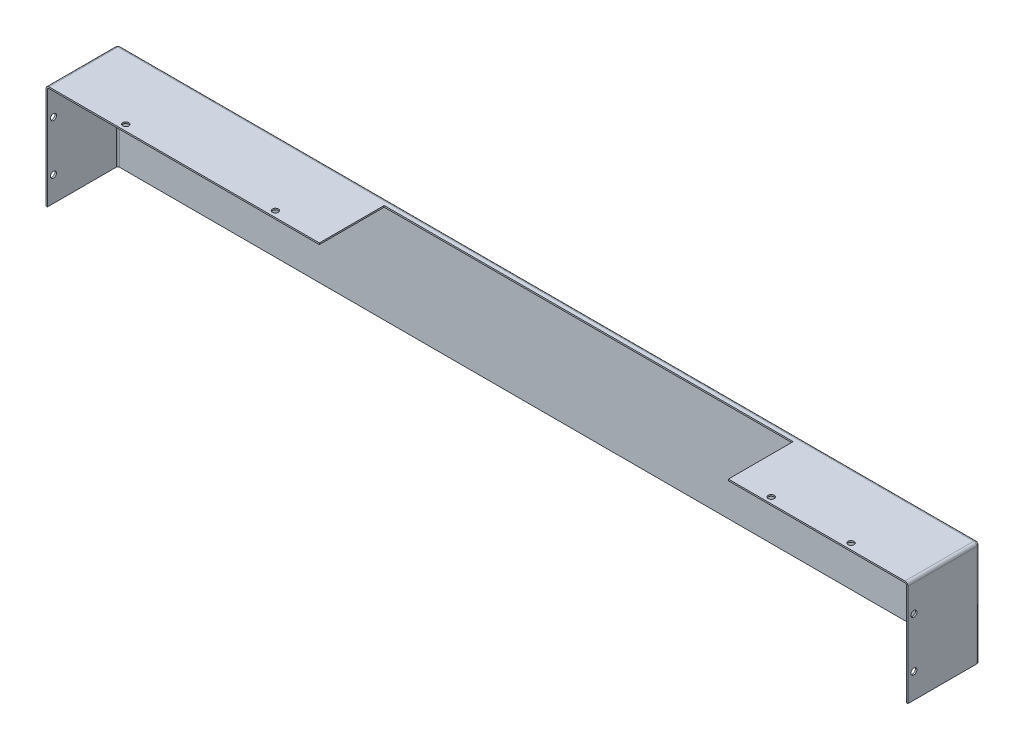
ISO-10303-21;
HEADER;
FILE_DESCRIPTION(('STEP AP214'),'2;1');
FILE_NAME('part.step','',(''),(''),'','','');
FILE_SCHEMA(('AUTOMOTIVE_DESIGN { 1 0 10303 214 1 1 1 1 }'));
ENDSEC;
DATA;
#1=APPLICATION_CONTEXT('core data for automotive mechanical design processes');
#2=APPLICATION_PROTOCOL_DEFINITION('international standard','automotive_design',2000,#1);
#3=PRODUCT_CONTEXT('',#1,'mechanical');
#4=PRODUCT('Part','Part','',(#3));
#5=PRODUCT_RELATED_PRODUCT_CATEGORY('part','',(#4));
#6=PRODUCT_DEFINITION_FORMATION('','',#4);
#7=PRODUCT_DEFINITION_CONTEXT('part definition',#1,'design');
#8=PRODUCT_DEFINITION('design','',#6,#7);
#9=PRODUCT_DEFINITION_SHAPE('','',#8);
#10=(LENGTH_UNIT() NAMED_UNIT(*) SI_UNIT(.MILLI.,.METRE.));
#11=(NAMED_UNIT(*) PLANE_ANGLE_UNIT() SI_UNIT($,.RADIAN.));
#12=(NAMED_UNIT(*) SI_UNIT($,.STERADIAN.) SOLID_ANGLE_UNIT());
#13=UNCERTAINTY_MEASURE_WITH_UNIT(LENGTH_MEASURE(1.E-05),#10,'distance_accuracy_value','');
#14=(GEOMETRIC_REPRESENTATION_CONTEXT(3) GLOBAL_UNCERTAINTY_ASSIGNED_CONTEXT((#13)) GLOBAL_UNIT_ASSIGNED_CONTEXT((#10,
#11,#12)) REPRESENTATION_CONTEXT('',''));
#15=CARTESIAN_POINT('',(0.,0.,0.));
#16=DIRECTION('',(0.,0.,1.));
#17=DIRECTION('',(1.,0.,0.));
#18=AXIS2_PLACEMENT_3D('',#15,#16,#17);
#19=CARTESIAN_POINT('',(0.,105.,72.));
#20=DIRECTION('',(0.,0.,-1.));
#21=DIRECTION('',(-1.,0.,0.));
#22=AXIS2_PLACEMENT_3D('',#19,#20,#21);
#23=PLANE('',#22);
#24=DIRECTION('',(-1.,0.,0.));
#25=VECTOR('',#24,1.);
#26=CARTESIAN_POINT('',(0.,105.,72.));
#27=LINE('',#26,#25);
#28=CARTESIAN_POINT('',(861.,105.,72.));
#29=VERTEX_POINT('',#28);
#30=CARTESIAN_POINT('',(684.,105.,72.));
#31=VERTEX_POINT('',#30);
#32=EDGE_CURVE('E278',#29,#31,#27,.T.);
#33=ORIENTED_EDGE('',*,*,#32,.T.);
#34=DIRECTION('',(0.,1.,0.));
#35=VECTOR('',#34,1.);
#36=CARTESIAN_POINT('',(684.,40.,72.));
#37=LINE('',#36,#35);
#38=CARTESIAN_POINT('',(684.,103.5,72.));
#39=VERTEX_POINT('',#38);
#40=EDGE_CURVE('E185',#39,#31,#37,.T.);
#41=ORIENTED_EDGE('',*,*,#40,.F.);
#42=DIRECTION('',(-1.,0.,0.));
#43=VECTOR('',#42,1.);
#44=CARTESIAN_POINT('',(0.,103.5,72.));
#45=LINE('',#44,#43);
#46=CARTESIAN_POINT('',(861.,103.5,72.));
#47=VERTEX_POINT('',#46);
#48=EDGE_CURVE('E259',#47,#39,#45,.T.);
#49=ORIENTED_EDGE('',*,*,#48,.F.);
#50=CARTESIAN_POINT('',(861.,102.,72.));
#51=DIRECTION('',(0.,0.,-1.));
#52=DIRECTION('',(-1.,0.,0.));
#53=AXIS2_PLACEMENT_3D('',#50,#51,#52);
#54=CIRCLE('',#53,1.5);
#55=CARTESIAN_POINT('',(862.5,102.,72.));
#56=VERTEX_POINT('',#55);
#57=EDGE_CURVE('E207',#56,#47,#54,.F.);
#58=ORIENTED_EDGE('',*,*,#57,.F.);
#59=DIRECTION('',(0.,1.,0.));
#60=VECTOR('',#59,1.);
#61=CARTESIAN_POINT('',(862.5,105.,72.));
#62=LINE('',#61,#60);
#63=CARTESIAN_POINT('',(862.5,0.,72.));
#64=VERTEX_POINT('',#63);
#65=EDGE_CURVE('E249',#64,#56,#62,.T.);
#66=ORIENTED_EDGE('',*,*,#65,.F.);
#67=DIRECTION('',(1.,0.,0.));
#68=VECTOR('',#67,1.);
#69=CARTESIAN_POINT('',(0.,0.,72.));
#70=LINE('',#69,#68);
#71=CARTESIAN_POINT('',(864.,0.,72.));
#72=VERTEX_POINT('',#71);
#73=EDGE_CURVE('E269',#64,#72,#70,.T.);
#74=ORIENTED_EDGE('',*,*,#73,.T.);
#75=DIRECTION('',(0.,1.,0.));
#76=VECTOR('',#75,1.);
#77=CARTESIAN_POINT('',(864.,0.,72.));
#78=LINE('',#77,#76);
#79=CARTESIAN_POINT('',(864.,102.,72.));
#80=VERTEX_POINT('',#79);
#81=EDGE_CURVE('E274',#72,#80,#78,.T.);
#82=ORIENTED_EDGE('',*,*,#81,.T.);
#83=CARTESIAN_POINT('',(861.,102.,72.));
#84=DIRECTION('',(0.,0.,-1.));
#85=DIRECTION('',(-1.,0.,0.));
#86=AXIS2_PLACEMENT_3D('',#83,#84,#85);
#87=CIRCLE('',#86,3.);
#88=EDGE_CURVE('E313',#80,#29,#87,.F.);
#89=ORIENTED_EDGE('',*,*,#88,.T.);
#90=EDGE_LOOP('',(#33,#41,#49,#58,#66,#74,#82,#89));
#91=FACE_BOUND('',#90,.T.);
#92=ADVANCED_FACE('F33',(#91),#23,.F.);
#93=CARTESIAN_POINT('',(274.,103.5,72.));
#94=VERTEX_POINT('',#93);
#95=CARTESIAN_POINT('',(3.,103.5,72.));
#96=VERTEX_POINT('',#95);
#97=EDGE_CURVE('E262',#94,#96,#45,.T.);
#98=ORIENTED_EDGE('',*,*,#97,.F.);
#99=DIRECTION('',(0.,1.,0.));
#100=VECTOR('',#99,1.);
#101=CARTESIAN_POINT('',(274.,40.,72.));
#102=LINE('',#101,#100);
#103=CARTESIAN_POINT('',(274.,105.,72.));
#104=VERTEX_POINT('',#103);
#105=EDGE_CURVE('E199',#94,#104,#102,.T.);
#106=ORIENTED_EDGE('',*,*,#105,.T.);
#107=CARTESIAN_POINT('',(3.,105.,72.));
#108=VERTEX_POINT('',#107);
#109=EDGE_CURVE('E277',#104,#108,#27,.T.);
#110=ORIENTED_EDGE('',*,*,#109,.T.);
#111=CARTESIAN_POINT('',(3.,102.,72.));
#112=DIRECTION('',(0.,0.,-1.));
#113=DIRECTION('',(-1.,0.,0.));
#114=AXIS2_PLACEMENT_3D('',#111,#112,#113);
#115=CIRCLE('',#114,3.);
#116=CARTESIAN_POINT('',(0.,102.,72.));
#117=VERTEX_POINT('',#116);
#118=EDGE_CURVE('E311',#108,#117,#115,.F.);
#119=ORIENTED_EDGE('',*,*,#118,.T.);
#120=DIRECTION('',(0.,-1.,0.));
#121=VECTOR('',#120,1.);
#122=CARTESIAN_POINT('',(0.,0.,72.));
#123=LINE('',#122,#121);
#124=CARTESIAN_POINT('',(0.,0.,72.));
#125=VERTEX_POINT('',#124);
#126=EDGE_CURVE('E267',#117,#125,#123,.T.);
#127=ORIENTED_EDGE('',*,*,#126,.T.);
#128=CARTESIAN_POINT('',(1.5,0.,72.));
#129=VERTEX_POINT('',#128);
#130=EDGE_CURVE('E271',#125,#129,#70,.T.);
#131=ORIENTED_EDGE('',*,*,#130,.T.);
#132=DIRECTION('',(0.,-1.,0.));
#133=VECTOR('',#132,1.);
#134=CARTESIAN_POINT('',(1.5,105.,72.));
#135=LINE('',#134,#133);
#136=CARTESIAN_POINT('',(1.5,102.,72.));
#137=VERTEX_POINT('',#136);
#138=EDGE_CURVE('E247',#137,#129,#135,.T.);
#139=ORIENTED_EDGE('',*,*,#138,.F.);
#140=CARTESIAN_POINT('',(3.,102.,72.));
#141=DIRECTION('',(0.,0.,-1.));
#142=DIRECTION('',(-1.,0.,0.));
#143=AXIS2_PLACEMENT_3D('',#140,#141,#142);
#144=CIRCLE('',#143,1.5);
#145=EDGE_CURVE('E219',#96,#137,#144,.F.);
#146=ORIENTED_EDGE('',*,*,#145,.F.);
#147=EDGE_LOOP('',(#98,#106,#110,#119,#127,#131,#139,#146));
#148=FACE_BOUND('',#147,.T.);
#149=ADVANCED_FACE('F404',(#148),#23,.F.);
#150=CARTESIAN_POINT('',(0.,0.,72.));
#151=DIRECTION('',(1.,0.,0.));
#152=DIRECTION('',(0.,0.,-1.));
#153=AXIS2_PLACEMENT_3D('',#150,#151,#152);
#154=PLANE('',#153);
#155=CARTESIAN_POINT('',(0.,25.,66.));
#156=DIRECTION('',(1.,0.,0.));
#157=DIRECTION('',(0.,0.,-1.));
#158=AXIS2_PLACEMENT_3D('',#155,#156,#157);
#159=CIRCLE('',#158,3.00000000000001);
#160=CARTESIAN_POINT('',(0.,25.,63.));
#161=VERTEX_POINT('',#160);
#162=EDGE_CURVE('E344',#161,#161,#159,.T.);
#163=ORIENTED_EDGE('',*,*,#162,.T.);
#164=EDGE_LOOP('',(#163));
#165=FACE_BOUND('',#164,.T.);
#166=CARTESIAN_POINT('',(0.,75.,66.));
#167=DIRECTION('',(1.,0.,0.));
#168=DIRECTION('',(0.,0.,-1.));
#169=AXIS2_PLACEMENT_3D('',#166,#167,#168);
#170=CIRCLE('',#169,3.00000000000001);
#171=CARTESIAN_POINT('',(0.,75.,63.));
#172=VERTEX_POINT('',#171);
#173=EDGE_CURVE('E339',#172,#172,#170,.T.);
#174=ORIENTED_EDGE('',*,*,#173,.T.);
#175=EDGE_LOOP('',(#174));
#176=FACE_BOUND('',#175,.T.);
#177=ORIENTED_EDGE('',*,*,#126,.F.);
#178=DIRECTION('',(0.,0.,-1.));
#179=VECTOR('',#178,1.);
#180=CARTESIAN_POINT('',(0.,102.,72.));
#181=LINE('',#180,#179);
#182=CARTESIAN_POINT('',(0.,102.,3.));
#183=VERTEX_POINT('',#182);
#184=EDGE_CURVE('E317',#117,#183,#181,.T.);
#185=ORIENTED_EDGE('',*,*,#184,.T.);
#186=DIRECTION('',(0.,-1.,0.));
#187=VECTOR('',#186,1.);
#188=CARTESIAN_POINT('',(0.,0.,3.));
#189=LINE('',#188,#187);
#190=CARTESIAN_POINT('',(0.,0.,3.));
#191=VERTEX_POINT('',#190);
#192=EDGE_CURVE('E315',#183,#191,#189,.T.);
#193=ORIENTED_EDGE('',*,*,#192,.T.);
#194=DIRECTION('',(0.,0.,-1.));
#195=VECTOR('',#194,1.);
#196=CARTESIAN_POINT('',(0.,0.,72.));
#197=LINE('',#196,#195);
#198=EDGE_CURVE('E286',#125,#191,#197,.T.);
#199=ORIENTED_EDGE('',*,*,#198,.F.);
#200=EDGE_LOOP('',(#177,#185,#193,#199));
#201=FACE_BOUND('',#200,.T.);
#202=ADVANCED_FACE('F409',(#165,#176,#201),#154,.F.);
#203=CARTESIAN_POINT('',(0.,0.,72.));
#204=DIRECTION('',(0.,1.,0.));
#205=DIRECTION('',(0.,0.,1.));
#206=AXIS2_PLACEMENT_3D('',#203,#204,#205);
#207=PLANE('',#206);
#208=ORIENTED_EDGE('',*,*,#73,.F.);
#209=DIRECTION('',(0.,0.,-1.));
#210=VECTOR('',#209,1.);
#211=CARTESIAN_POINT('',(862.5,0.,72.));
#212=LINE('',#211,#210);
#213=CARTESIAN_POINT('',(862.5,0.,3.));
#214=VERTEX_POINT('',#213);
#215=EDGE_CURVE('E252',#64,#214,#212,.T.);
#216=ORIENTED_EDGE('',*,*,#215,.T.);
#217=CARTESIAN_POINT('',(861.,0.,3.));
#218=DIRECTION('',(0.,1.,0.));
#219=DIRECTION('',(0.,0.,1.));
#220=AXIS2_PLACEMENT_3D('',#217,#218,#219);
#221=CIRCLE('',#220,1.5);
#222=CARTESIAN_POINT('',(861.,0.,1.5));
#223=VERTEX_POINT('',#222);
#224=EDGE_CURVE('E221',#223,#214,#221,.F.);
#225=ORIENTED_EDGE('',*,*,#224,.F.);
#226=DIRECTION('',(1.,0.,0.));
#227=VECTOR('',#226,1.);
#228=CARTESIAN_POINT('',(0.,0.,1.5));
#229=LINE('',#228,#227);
#230=CARTESIAN_POINT('',(3.,0.,1.5));
#231=VERTEX_POINT('',#230);
#232=EDGE_CURVE('E216',#231,#223,#229,.T.);
#233=ORIENTED_EDGE('',*,*,#232,.F.);
#234=CARTESIAN_POINT('',(3.,0.,3.));
#235=DIRECTION('',(0.,1.,0.));
#236=DIRECTION('',(0.,0.,1.));
#237=AXIS2_PLACEMENT_3D('',#234,#235,#236);
#238=CIRCLE('',#237,1.5);
#239=CARTESIAN_POINT('',(1.5,0.,3.));
#240=VERTEX_POINT('',#239);
#241=EDGE_CURVE('E234',#240,#231,#238,.F.);
#242=ORIENTED_EDGE('',*,*,#241,.F.);
#243=DIRECTION('',(0.,0.,-1.));
#244=VECTOR('',#243,1.);
#245=CARTESIAN_POINT('',(1.5,0.,72.));
#246=LINE('',#245,#244);
#247=EDGE_CURVE('E241',#129,#240,#246,.T.);
#248=ORIENTED_EDGE('',*,*,#247,.F.);
#249=ORIENTED_EDGE('',*,*,#130,.F.);
#250=ORIENTED_EDGE('',*,*,#198,.T.);
#251=CARTESIAN_POINT('',(3.,0.,3.));
#252=DIRECTION('',(0.,1.,0.));
#253=DIRECTION('',(0.,0.,1.));
#254=AXIS2_PLACEMENT_3D('',#251,#252,#253);
#255=CIRCLE('',#254,3.);
#256=CARTESIAN_POINT('',(3.,0.,0.));
#257=VERTEX_POINT('',#256);
#258=EDGE_CURVE('E300',#191,#257,#255,.F.);
#259=ORIENTED_EDGE('',*,*,#258,.T.);
#260=DIRECTION('',(1.,0.,0.));
#261=VECTOR('',#260,1.);
#262=CARTESIAN_POINT('',(0.,0.,0.));
#263=LINE('',#262,#261);
#264=CARTESIAN_POINT('',(861.,0.,0.));
#265=VERTEX_POINT('',#264);
#266=EDGE_CURVE('E270',#257,#265,#263,.T.);
#267=ORIENTED_EDGE('',*,*,#266,.T.);
#268=CARTESIAN_POINT('',(861.,0.,3.));
#269=DIRECTION('',(0.,1.,0.));
#270=DIRECTION('',(0.,0.,1.));
#271=AXIS2_PLACEMENT_3D('',#268,#269,#270);
#272=CIRCLE('',#271,3.);
#273=CARTESIAN_POINT('',(864.,0.,3.));
#274=VERTEX_POINT('',#273);
#275=EDGE_CURVE('E302',#265,#274,#272,.F.);
#276=ORIENTED_EDGE('',*,*,#275,.T.);
#277=DIRECTION('',(0.,0.,-1.));
#278=VECTOR('',#277,1.);
#279=CARTESIAN_POINT('',(864.,0.,72.));
#280=LINE('',#279,#278);
#281=EDGE_CURVE('E280',#72,#274,#280,.T.);
#282=ORIENTED_EDGE('',*,*,#281,.F.);
#283=EDGE_LOOP('',(#208,#216,#225,#233,#242,#248,#249,#250,#259,#267,#276,#282));
#284=FACE_BOUND('',#283,.T.);
#285=ADVANCED_FACE('F400',(#284),#207,.F.);
#286=CARTESIAN_POINT('',(864.,0.,72.));
#287=DIRECTION('',(-1.,0.,0.));
#288=DIRECTION('',(0.,0.,1.));
#289=AXIS2_PLACEMENT_3D('',#286,#287,#288);
#290=PLANE('',#289);
#291=CARTESIAN_POINT('',(864.,25.,66.));
#292=DIRECTION('',(1.,0.,0.));
#293=DIRECTION('',(0.,0.,-1.));
#294=AXIS2_PLACEMENT_3D('',#291,#292,#293);
#295=CIRCLE('',#294,3.00000000000001);
#296=CARTESIAN_POINT('',(864.,25.,63.));
#297=VERTEX_POINT('',#296);
#298=EDGE_CURVE('E348',#297,#297,#295,.T.);
#299=ORIENTED_EDGE('',*,*,#298,.F.);
#300=EDGE_LOOP('',(#299));
#301=FACE_BOUND('',#300,.T.);
#302=CARTESIAN_POINT('',(864.,75.,66.));
#303=DIRECTION('',(1.,0.,0.));
#304=DIRECTION('',(0.,0.,-1.));
#305=AXIS2_PLACEMENT_3D('',#302,#303,#304);
#306=CIRCLE('',#305,3.00000000000001);
#307=CARTESIAN_POINT('',(864.,75.,63.));
#308=VERTEX_POINT('',#307);
#309=EDGE_CURVE('E376',#308,#308,#306,.T.);
#310=ORIENTED_EDGE('',*,*,#309,.F.);
#311=EDGE_LOOP('',(#310));
#312=FACE_BOUND('',#311,.T.);
#313=ORIENTED_EDGE('',*,*,#281,.T.);
#314=DIRECTION('',(0.,1.,0.));
#315=VECTOR('',#314,1.);
#316=CARTESIAN_POINT('',(864.,105.,3.));
#317=LINE('',#316,#315);
#318=CARTESIAN_POINT('',(864.,102.,3.));
#319=VERTEX_POINT('',#318);
#320=EDGE_CURVE('E291',#274,#319,#317,.T.);
#321=ORIENTED_EDGE('',*,*,#320,.T.);
#322=DIRECTION('',(0.,0.,-1.));
#323=VECTOR('',#322,1.);
#324=CARTESIAN_POINT('',(864.,102.,72.));
#325=LINE('',#324,#323);
#326=EDGE_CURVE('E289',#319,#80,#325,.F.);
#327=ORIENTED_EDGE('',*,*,#326,.T.);
#328=ORIENTED_EDGE('',*,*,#81,.F.);
#329=EDGE_LOOP('',(#313,#321,#327,#328));
#330=FACE_BOUND('',#329,.T.);
#331=ADVANCED_FACE('F442',(#301,#312,#330),#290,.F.);
#332=CARTESIAN_POINT('',(0.,105.,72.));
#333=DIRECTION('',(0.,-1.,0.));
#334=DIRECTION('',(0.,0.,-1.));
#335=AXIS2_PLACEMENT_3D('',#332,#333,#334);
#336=PLANE('',#335);
#337=CARTESIAN_POINT('',(224.,105.,66.));
#338=DIRECTION('',(0.,1.,0.));
#339=DIRECTION('',(0.,0.,1.));
#340=AXIS2_PLACEMENT_3D('',#337,#338,#339);
#341=CIRCLE('',#340,2.99999999999999);
#342=CARTESIAN_POINT('',(224.,105.,69.));
#343=VERTEX_POINT('',#342);
#344=EDGE_CURVE('E365',#343,#343,#341,.T.);
#345=ORIENTED_EDGE('',*,*,#344,.F.);
#346=EDGE_LOOP('',(#345));
#347=FACE_BOUND('',#346,.T.);
#348=CARTESIAN_POINT('',(74.,105.,66.));
#349=DIRECTION('',(0.,1.,0.));
#350=DIRECTION('',(0.,0.,1.));
#351=AXIS2_PLACEMENT_3D('',#348,#349,#350);
#352=CIRCLE('',#351,3.00000000000001);
#353=CARTESIAN_POINT('',(74.,105.,69.));
#354=VERTEX_POINT('',#353);
#355=EDGE_CURVE('E355',#354,#354,#352,.T.);
#356=ORIENTED_EDGE('',*,*,#355,.F.);
#357=EDGE_LOOP('',(#356));
#358=FACE_BOUND('',#357,.T.);
#359=CARTESIAN_POINT('',(801.,105.,66.));
#360=DIRECTION('',(0.,1.,0.));
#361=DIRECTION('',(0.,0.,1.));
#362=AXIS2_PLACEMENT_3D('',#359,#360,#361);
#363=CIRCLE('',#362,3.00000000000005);
#364=CARTESIAN_POINT('',(801.,105.,69.));
#365=VERTEX_POINT('',#364);
#366=EDGE_CURVE('E352',#365,#365,#363,.T.);
#367=ORIENTED_EDGE('',*,*,#366,.F.);
#368=EDGE_LOOP('',(#367));
#369=FACE_BOUND('',#368,.T.);
#370=CARTESIAN_POINT('',(721.,105.,66.));
#371=DIRECTION('',(0.,1.,0.));
#372=DIRECTION('',(0.,0.,1.));
#373=AXIS2_PLACEMENT_3D('',#370,#371,#372);
#374=CIRCLE('',#373,3.00000000000005);
#375=CARTESIAN_POINT('',(721.,105.,69.));
#376=VERTEX_POINT('',#375);
#377=EDGE_CURVE('E349',#376,#376,#374,.T.);
#378=ORIENTED_EDGE('',*,*,#377,.F.);
#379=EDGE_LOOP('',(#378));
#380=FACE_BOUND('',#379,.T.);
#381=DIRECTION('',(-1.,0.,0.));
#382=VECTOR('',#381,1.);
#383=CARTESIAN_POINT('',(684.,105.,6.99999999999999));
#384=LINE('',#383,#382);
#385=CARTESIAN_POINT('',(684.,105.,6.99999999999999));
#386=VERTEX_POINT('',#385);
#387=CARTESIAN_POINT('',(274.,105.,7.00000000000005));
#388=VERTEX_POINT('',#387);
#389=EDGE_CURVE('E173',#386,#388,#384,.T.);
#390=ORIENTED_EDGE('',*,*,#389,.F.);
#391=DIRECTION('',(0.,0.,-1.));
#392=VECTOR('',#391,1.);
#393=CARTESIAN_POINT('',(684.,105.,72.));
#394=LINE('',#393,#392);
#395=EDGE_CURVE('E182',#31,#386,#394,.T.);
#396=ORIENTED_EDGE('',*,*,#395,.F.);
#397=ORIENTED_EDGE('',*,*,#32,.F.);
#398=DIRECTION('',(0.,0.,-1.));
#399=VECTOR('',#398,1.);
#400=CARTESIAN_POINT('',(861.,105.,72.));
#401=LINE('',#400,#399);
#402=CARTESIAN_POINT('',(861.,105.,3.));
#403=VERTEX_POINT('',#402);
#404=EDGE_CURVE('E309',#29,#403,#401,.T.);
#405=ORIENTED_EDGE('',*,*,#404,.T.);
#406=DIRECTION('',(-1.,0.,0.));
#407=VECTOR('',#406,1.);
#408=CARTESIAN_POINT('',(0.,105.,3.));
#409=LINE('',#408,#407);
#410=CARTESIAN_POINT('',(3.,105.,3.));
#411=VERTEX_POINT('',#410);
#412=EDGE_CURVE('E304',#403,#411,#409,.T.);
#413=ORIENTED_EDGE('',*,*,#412,.T.);
#414=DIRECTION('',(0.,0.,-1.));
#415=VECTOR('',#414,1.);
#416=CARTESIAN_POINT('',(3.,105.,72.));
#417=LINE('',#416,#415);
#418=EDGE_CURVE('E306',#411,#108,#417,.F.);
#419=ORIENTED_EDGE('',*,*,#418,.T.);
#420=ORIENTED_EDGE('',*,*,#109,.F.);
#421=DIRECTION('',(0.,0.,1.));
#422=VECTOR('',#421,1.);
#423=CARTESIAN_POINT('',(274.,105.,72.));
#424=LINE('',#423,#422);
#425=EDGE_CURVE('E179',#388,#104,#424,.T.);
#426=ORIENTED_EDGE('',*,*,#425,.F.);
#427=EDGE_LOOP('',(#390,#396,#397,#405,#413,#419,#420,#426));
#428=FACE_BOUND('',#427,.T.);
#429=ADVANCED_FACE('F191',(#347,#358,#369,#380,#428),#336,.F.);
#430=CARTESIAN_POINT('',(0.,105.,0.));
#431=DIRECTION('',(0.,0.,-1.));
#432=DIRECTION('',(-1.,0.,0.));
#433=AXIS2_PLACEMENT_3D('',#430,#431,#432);
#434=PLANE('',#433);
#435=DIRECTION('',(-1.,0.,0.));
#436=VECTOR('',#435,1.);
#437=CARTESIAN_POINT('',(864.,102.,0.));
#438=LINE('',#437,#436);
#439=CARTESIAN_POINT('',(3.,102.,0.));
#440=VERTEX_POINT('',#439);
#441=CARTESIAN_POINT('',(861.,102.,0.));
#442=VERTEX_POINT('',#441);
#443=EDGE_CURVE('E294',#440,#442,#438,.F.);
#444=ORIENTED_EDGE('',*,*,#443,.T.);
#445=DIRECTION('',(0.,1.,0.));
#446=VECTOR('',#445,1.);
#447=CARTESIAN_POINT('',(861.,0.,0.));
#448=LINE('',#447,#446);
#449=EDGE_CURVE('E298',#442,#265,#448,.F.);
#450=ORIENTED_EDGE('',*,*,#449,.T.);
#451=ORIENTED_EDGE('',*,*,#266,.F.);
#452=DIRECTION('',(0.,-1.,0.));
#453=VECTOR('',#452,1.);
#454=CARTESIAN_POINT('',(3.,105.,0.));
#455=LINE('',#454,#453);
#456=EDGE_CURVE('E296',#257,#440,#455,.F.);
#457=ORIENTED_EDGE('',*,*,#456,.T.);
#458=EDGE_LOOP('',(#444,#450,#451,#457));
#459=FACE_BOUND('',#458,.T.);
#460=ADVANCED_FACE('F426',(#459),#434,.T.);
#461=CARTESIAN_POINT('',(3.,102.,72.));
#462=DIRECTION('',(0.,0.,-1.));
#463=DIRECTION('',(-1.,0.,0.));
#464=AXIS2_PLACEMENT_3D('',#461,#462,#463);
#465=CYLINDRICAL_SURFACE('',#464,3.);
#466=ORIENTED_EDGE('',*,*,#118,.F.);
#467=ORIENTED_EDGE('',*,*,#418,.F.);
#468=CARTESIAN_POINT('',(3.,102.,3.));
#469=DIRECTION('',(0.,0.,-1.));
#470=DIRECTION('',(-1.,0.,0.));
#471=AXIS2_PLACEMENT_3D('',#468,#469,#470);
#472=CIRCLE('',#471,3.);
#473=EDGE_CURVE('E283',#183,#411,#472,.T.);
#474=ORIENTED_EDGE('',*,*,#473,.F.);
#475=ORIENTED_EDGE('',*,*,#184,.F.);
#476=EDGE_LOOP('',(#466,#467,#474,#475));
#477=FACE_BOUND('',#476,.T.);
#478=ADVANCED_FACE('F35',(#477),#465,.T.);
#479=CARTESIAN_POINT('',(3.,0.,3.));
#480=DIRECTION('',(0.,1.,0.));
#481=DIRECTION('',(0.,0.,1.));
#482=AXIS2_PLACEMENT_3D('',#479,#480,#481);
#483=CYLINDRICAL_SURFACE('',#482,3.);
#484=ORIENTED_EDGE('',*,*,#258,.F.);
#485=ORIENTED_EDGE('',*,*,#192,.F.);
#486=CARTESIAN_POINT('',(3.,102.,3.));
#487=DIRECTION('',(0.,1.,0.));
#488=DIRECTION('',(0.,0.,1.));
#489=AXIS2_PLACEMENT_3D('',#486,#487,#488);
#490=CIRCLE('',#489,3.);
#491=EDGE_CURVE('E329',#440,#183,#490,.T.);
#492=ORIENTED_EDGE('',*,*,#491,.F.);
#493=ORIENTED_EDGE('',*,*,#456,.F.);
#494=EDGE_LOOP('',(#484,#485,#492,#493));
#495=FACE_BOUND('',#494,.T.);
#496=ADVANCED_FACE('F422',(#495),#483,.T.);
#497=CARTESIAN_POINT('',(3.,102.,3.));
#498=DIRECTION('',(0.,0.,1.));
#499=DIRECTION('',(1.,0.,0.));
#500=AXIS2_PLACEMENT_3D('',#497,#498,#499);
#501=SPHERICAL_SURFACE('',#500,3.);
#502=ORIENTED_EDGE('',*,*,#491,.T.);
#503=ORIENTED_EDGE('',*,*,#473,.T.);
#504=CARTESIAN_POINT('',(3.,102.,3.));
#505=DIRECTION('',(-1.,0.,0.));
#506=DIRECTION('',(0.,0.,1.));
#507=AXIS2_PLACEMENT_3D('',#504,#505,#506);
#508=CIRCLE('',#507,3.);
#509=EDGE_CURVE('E326',#440,#411,#508,.F.);
#510=ORIENTED_EDGE('',*,*,#509,.F.);
#511=EDGE_LOOP('',(#502,#503,#510));
#512=FACE_BOUND('',#511,.T.);
#513=ADVANCED_FACE('F417',(#512),#501,.T.);
#514=CARTESIAN_POINT('',(861.,102.,72.));
#515=DIRECTION('',(0.,0.,-1.));
#516=DIRECTION('',(-1.,0.,0.));
#517=AXIS2_PLACEMENT_3D('',#514,#515,#516);
#518=CYLINDRICAL_SURFACE('',#517,3.);
#519=ORIENTED_EDGE('',*,*,#88,.F.);
#520=ORIENTED_EDGE('',*,*,#326,.F.);
#521=CARTESIAN_POINT('',(861.,102.,3.));
#522=DIRECTION('',(0.,0.,-1.));
#523=DIRECTION('',(-1.,0.,0.));
#524=AXIS2_PLACEMENT_3D('',#521,#522,#523);
#525=CIRCLE('',#524,3.);
#526=EDGE_CURVE('E323',#403,#319,#525,.T.);
#527=ORIENTED_EDGE('',*,*,#526,.F.);
#528=ORIENTED_EDGE('',*,*,#404,.F.);
#529=EDGE_LOOP('',(#519,#520,#527,#528));
#530=FACE_BOUND('',#529,.T.);
#531=ADVANCED_FACE('F439',(#530),#518,.T.);
#532=CARTESIAN_POINT('',(0.,102.,3.));
#533=DIRECTION('',(1.,0.,0.));
#534=DIRECTION('',(0.,0.,-1.));
#535=AXIS2_PLACEMENT_3D('',#532,#533,#534);
#536=CYLINDRICAL_SURFACE('',#535,3.);
#537=ORIENTED_EDGE('',*,*,#509,.T.);
#538=ORIENTED_EDGE('',*,*,#412,.F.);
#539=CARTESIAN_POINT('',(861.,102.,3.));
#540=DIRECTION('',(1.,0.,0.));
#541=DIRECTION('',(0.,0.,-1.));
#542=AXIS2_PLACEMENT_3D('',#539,#540,#541);
#543=CIRCLE('',#542,3.);
#544=EDGE_CURVE('E320',#442,#403,#543,.T.);
#545=ORIENTED_EDGE('',*,*,#544,.F.);
#546=ORIENTED_EDGE('',*,*,#443,.F.);
#547=EDGE_LOOP('',(#537,#538,#545,#546));
#548=FACE_BOUND('',#547,.T.);
#549=ADVANCED_FACE('F482',(#548),#536,.T.);
#550=CARTESIAN_POINT('',(861.,102.,3.));
#551=DIRECTION('',(0.,0.,1.));
#552=DIRECTION('',(1.,0.,0.));
#553=AXIS2_PLACEMENT_3D('',#550,#551,#552);
#554=SPHERICAL_SURFACE('',#553,3.);
#555=ORIENTED_EDGE('',*,*,#544,.T.);
#556=ORIENTED_EDGE('',*,*,#526,.T.);
#557=CARTESIAN_POINT('',(861.,102.,3.));
#558=DIRECTION('',(0.,1.,0.));
#559=DIRECTION('',(0.,0.,1.));
#560=AXIS2_PLACEMENT_3D('',#557,#558,#559);
#561=CIRCLE('',#560,3.);
#562=EDGE_CURVE('E204',#442,#319,#561,.F.);
#563=ORIENTED_EDGE('',*,*,#562,.F.);
#564=EDGE_LOOP('',(#555,#556,#563));
#565=FACE_BOUND('',#564,.T.);
#566=ADVANCED_FACE('F433',(#565),#554,.T.);
#567=CARTESIAN_POINT('',(861.,0.,3.));
#568=DIRECTION('',(0.,-1.,0.));
#569=DIRECTION('',(0.,0.,-1.));
#570=AXIS2_PLACEMENT_3D('',#567,#568,#569);
#571=CYLINDRICAL_SURFACE('',#570,3.);
#572=ORIENTED_EDGE('',*,*,#275,.F.);
#573=ORIENTED_EDGE('',*,*,#449,.F.);
#574=ORIENTED_EDGE('',*,*,#562,.T.);
#575=ORIENTED_EDGE('',*,*,#320,.F.);
#576=EDGE_LOOP('',(#572,#573,#574,#575));
#577=FACE_BOUND('',#576,.T.);
#578=ADVANCED_FACE('F389',(#577),#571,.T.);
#579=CARTESIAN_POINT('',(1.5,0.,72.));
#580=DIRECTION('',(1.,0.,0.));
#581=DIRECTION('',(0.,0.,-1.));
#582=AXIS2_PLACEMENT_3D('',#579,#580,#581);
#583=PLANE('',#582);
#584=CARTESIAN_POINT('',(1.5,25.,66.));
#585=DIRECTION('',(1.,0.,0.));
#586=DIRECTION('',(0.,0.,-1.));
#587=AXIS2_PLACEMENT_3D('',#584,#585,#586);
#588=CIRCLE('',#587,3.00000000000001);
#589=CARTESIAN_POINT('',(1.5,25.,63.));
#590=VERTEX_POINT('',#589);
#591=EDGE_CURVE('E343',#590,#590,#588,.T.);
#592=ORIENTED_EDGE('',*,*,#591,.F.);
#593=EDGE_LOOP('',(#592));
#594=FACE_BOUND('',#593,.T.);
#595=CARTESIAN_POINT('',(1.5,75.,66.));
#596=DIRECTION('',(1.,0.,0.));
#597=DIRECTION('',(0.,0.,-1.));
#598=AXIS2_PLACEMENT_3D('',#595,#596,#597);
#599=CIRCLE('',#598,3.00000000000001);
#600=CARTESIAN_POINT('',(1.5,75.,63.));
#601=VERTEX_POINT('',#600);
#602=EDGE_CURVE('E189',#601,#601,#599,.T.);
#603=ORIENTED_EDGE('',*,*,#602,.F.);
#604=EDGE_LOOP('',(#603));
#605=FACE_BOUND('',#604,.T.);
#606=ORIENTED_EDGE('',*,*,#138,.T.);
#607=ORIENTED_EDGE('',*,*,#247,.T.);
#608=DIRECTION('',(0.,1.,0.));
#609=VECTOR('',#608,1.);
#610=CARTESIAN_POINT('',(1.5,0.,3.));
#611=LINE('',#610,#609);
#612=CARTESIAN_POINT('',(1.5,102.,3.));
#613=VERTEX_POINT('',#612);
#614=EDGE_CURVE('E205',#613,#240,#611,.F.);
#615=ORIENTED_EDGE('',*,*,#614,.F.);
#616=DIRECTION('',(0.,0.,-1.));
#617=VECTOR('',#616,1.);
#618=CARTESIAN_POINT('',(1.5,102.,72.));
#619=LINE('',#618,#617);
#620=EDGE_CURVE('E58',#137,#613,#619,.T.);
#621=ORIENTED_EDGE('',*,*,#620,.F.);
#622=EDGE_LOOP('',(#606,#607,#615,#621));
#623=FACE_BOUND('',#622,.T.);
#624=ADVANCED_FACE('F386',(#594,#605,#623),#583,.T.);
#625=CARTESIAN_POINT('',(862.5,0.,72.));
#626=DIRECTION('',(-1.,0.,0.));
#627=DIRECTION('',(0.,0.,1.));
#628=AXIS2_PLACEMENT_3D('',#625,#626,#627);
#629=PLANE('',#628);
#630=CARTESIAN_POINT('',(862.5,25.,66.));
#631=DIRECTION('',(-1.,0.,0.));
#632=DIRECTION('',(0.,0.,1.));
#633=AXIS2_PLACEMENT_3D('',#630,#631,#632);
#634=CIRCLE('',#633,3.00000000000001);
#635=CARTESIAN_POINT('',(862.5,25.,69.));
#636=VERTEX_POINT('',#635);
#637=EDGE_CURVE('E340',#636,#636,#634,.T.);
#638=ORIENTED_EDGE('',*,*,#637,.F.);
#639=EDGE_LOOP('',(#638));
#640=FACE_BOUND('',#639,.T.);
#641=CARTESIAN_POINT('',(862.5,75.,66.));
#642=DIRECTION('',(-1.,0.,0.));
#643=DIRECTION('',(0.,0.,1.));
#644=AXIS2_PLACEMENT_3D('',#641,#642,#643);
#645=CIRCLE('',#644,3.00000000000001);
#646=CARTESIAN_POINT('',(862.5,75.,69.));
#647=VERTEX_POINT('',#646);
#648=EDGE_CURVE('E336',#647,#647,#645,.T.);
#649=ORIENTED_EDGE('',*,*,#648,.F.);
#650=EDGE_LOOP('',(#649));
#651=FACE_BOUND('',#650,.T.);
#652=ORIENTED_EDGE('',*,*,#215,.F.);
#653=ORIENTED_EDGE('',*,*,#65,.T.);
#654=DIRECTION('',(0.,0.,1.));
#655=VECTOR('',#654,1.);
#656=CARTESIAN_POINT('',(862.5,102.,72.));
#657=LINE('',#656,#655);
#658=CARTESIAN_POINT('',(862.5,102.,3.));
#659=VERTEX_POINT('',#658);
#660=EDGE_CURVE('E239',#659,#56,#657,.T.);
#661=ORIENTED_EDGE('',*,*,#660,.F.);
#662=DIRECTION('',(0.,1.,0.));
#663=VECTOR('',#662,1.);
#664=CARTESIAN_POINT('',(862.5,0.,3.));
#665=LINE('',#664,#663);
#666=EDGE_CURVE('E231',#214,#659,#665,.T.);
#667=ORIENTED_EDGE('',*,*,#666,.F.);
#668=EDGE_LOOP('',(#652,#653,#661,#667));
#669=FACE_BOUND('',#668,.T.);
#670=ADVANCED_FACE('F388',(#640,#651,#669),#629,.T.);
#671=CARTESIAN_POINT('',(0.,103.5,72.));
#672=DIRECTION('',(0.,-1.,0.));
#673=DIRECTION('',(0.,0.,-1.));
#674=AXIS2_PLACEMENT_3D('',#671,#672,#673);
#675=PLANE('',#674);
#676=CARTESIAN_POINT('',(224.,103.5,66.));
#677=DIRECTION('',(0.,-1.,0.));
#678=DIRECTION('',(0.,0.,-1.));
#679=AXIS2_PLACEMENT_3D('',#676,#677,#678);
#680=CIRCLE('',#679,2.99999999999999);
#681=CARTESIAN_POINT('',(224.,103.5,63.));
#682=VERTEX_POINT('',#681);
#683=EDGE_CURVE('E37',#682,#682,#680,.T.);
#684=ORIENTED_EDGE('',*,*,#683,.F.);
#685=EDGE_LOOP('',(#684));
#686=FACE_BOUND('',#685,.T.);
#687=CARTESIAN_POINT('',(74.,103.5,66.));
#688=DIRECTION('',(0.,-1.,0.));
#689=DIRECTION('',(0.,0.,-1.));
#690=AXIS2_PLACEMENT_3D('',#687,#688,#689);
#691=CIRCLE('',#690,3.00000000000001);
#692=CARTESIAN_POINT('',(74.,103.5,63.));
#693=VERTEX_POINT('',#692);
#694=EDGE_CURVE('E353',#693,#693,#691,.T.);
#695=ORIENTED_EDGE('',*,*,#694,.F.);
#696=EDGE_LOOP('',(#695));
#697=FACE_BOUND('',#696,.T.);
#698=CARTESIAN_POINT('',(801.,103.5,66.));
#699=DIRECTION('',(0.,-1.,0.));
#700=DIRECTION('',(0.,0.,-1.));
#701=AXIS2_PLACEMENT_3D('',#698,#699,#700);
#702=CIRCLE('',#701,3.00000000000005);
#703=CARTESIAN_POINT('',(801.,103.5,62.9999999999999));
#704=VERTEX_POINT('',#703);
#705=EDGE_CURVE('E350',#704,#704,#702,.T.);
#706=ORIENTED_EDGE('',*,*,#705,.F.);
#707=EDGE_LOOP('',(#706));
#708=FACE_BOUND('',#707,.T.);
#709=CARTESIAN_POINT('',(721.,103.5,66.));
#710=DIRECTION('',(0.,-1.,0.));
#711=DIRECTION('',(0.,0.,-1.));
#712=AXIS2_PLACEMENT_3D('',#709,#710,#711);
#713=CIRCLE('',#712,3.00000000000005);
#714=CARTESIAN_POINT('',(721.,103.5,62.9999999999999));
#715=VERTEX_POINT('',#714);
#716=EDGE_CURVE('E345',#715,#715,#713,.T.);
#717=ORIENTED_EDGE('',*,*,#716,.F.);
#718=EDGE_LOOP('',(#717));
#719=FACE_BOUND('',#718,.T.);
#720=DIRECTION('',(0.,0.,1.));
#721=VECTOR('',#720,1.);
#722=CARTESIAN_POINT('',(684.,103.5,72.));
#723=LINE('',#722,#721);
#724=CARTESIAN_POINT('',(684.,103.5,6.99999999999999));
#725=VERTEX_POINT('',#724);
#726=EDGE_CURVE('E11',#725,#39,#723,.T.);
#727=ORIENTED_EDGE('',*,*,#726,.F.);
#728=DIRECTION('',(1.,0.,0.));
#729=VECTOR('',#728,1.);
#730=CARTESIAN_POINT('',(0.,103.5,7.00000000000009));
#731=LINE('',#730,#729);
#732=CARTESIAN_POINT('',(274.,103.5,7.00000000000005));
#733=VERTEX_POINT('',#732);
#734=EDGE_CURVE('E176',#733,#725,#731,.T.);
#735=ORIENTED_EDGE('',*,*,#734,.F.);
#736=DIRECTION('',(0.,0.,-1.));
#737=VECTOR('',#736,1.);
#738=CARTESIAN_POINT('',(274.,103.5,72.));
#739=LINE('',#738,#737);
#740=EDGE_CURVE('E42',#94,#733,#739,.T.);
#741=ORIENTED_EDGE('',*,*,#740,.F.);
#742=ORIENTED_EDGE('',*,*,#97,.T.);
#743=DIRECTION('',(0.,0.,-1.));
#744=VECTOR('',#743,1.);
#745=CARTESIAN_POINT('',(3.,103.5,72.));
#746=LINE('',#745,#744);
#747=CARTESIAN_POINT('',(3.,103.5,3.));
#748=VERTEX_POINT('',#747);
#749=EDGE_CURVE('E208',#748,#96,#746,.F.);
#750=ORIENTED_EDGE('',*,*,#749,.F.);
#751=DIRECTION('',(1.,0.,0.));
#752=VECTOR('',#751,1.);
#753=CARTESIAN_POINT('',(0.,103.5,3.));
#754=LINE('',#753,#752);
#755=CARTESIAN_POINT('',(861.,103.5,3.));
#756=VERTEX_POINT('',#755);
#757=EDGE_CURVE('E212',#756,#748,#754,.F.);
#758=ORIENTED_EDGE('',*,*,#757,.F.);
#759=DIRECTION('',(0.,0.,-1.));
#760=VECTOR('',#759,1.);
#761=CARTESIAN_POINT('',(861.,103.5,72.));
#762=LINE('',#761,#760);
#763=EDGE_CURVE('E211',#47,#756,#762,.T.);
#764=ORIENTED_EDGE('',*,*,#763,.F.);
#765=ORIENTED_EDGE('',*,*,#48,.T.);
#766=EDGE_LOOP('',(#727,#735,#741,#742,#750,#758,#764,#765));
#767=FACE_BOUND('',#766,.T.);
#768=ADVANCED_FACE('F475',(#686,#697,#708,#719,#767),#675,.T.);
#769=CARTESIAN_POINT('',(0.,105.,1.5));
#770=DIRECTION('',(0.,0.,-1.));
#771=DIRECTION('',(-1.,0.,0.));
#772=AXIS2_PLACEMENT_3D('',#769,#770,#771);
#773=PLANE('',#772);
#774=DIRECTION('',(-1.,0.,0.));
#775=VECTOR('',#774,1.);
#776=CARTESIAN_POINT('',(0.,102.,1.5));
#777=LINE('',#776,#775);
#778=CARTESIAN_POINT('',(3.,102.,1.5));
#779=VERTEX_POINT('',#778);
#780=CARTESIAN_POINT('',(861.,102.,1.5));
#781=VERTEX_POINT('',#780);
#782=EDGE_CURVE('E228',#779,#781,#777,.F.);
#783=ORIENTED_EDGE('',*,*,#782,.F.);
#784=DIRECTION('',(0.,1.,0.));
#785=VECTOR('',#784,1.);
#786=CARTESIAN_POINT('',(3.,105.,1.5));
#787=LINE('',#786,#785);
#788=EDGE_CURVE('E230',#231,#779,#787,.T.);
#789=ORIENTED_EDGE('',*,*,#788,.F.);
#790=ORIENTED_EDGE('',*,*,#232,.T.);
#791=DIRECTION('',(0.,1.,0.));
#792=VECTOR('',#791,1.);
#793=CARTESIAN_POINT('',(861.,105.,1.5));
#794=LINE('',#793,#792);
#795=EDGE_CURVE('E232',#781,#223,#794,.F.);
#796=ORIENTED_EDGE('',*,*,#795,.F.);
#797=EDGE_LOOP('',(#783,#789,#790,#796));
#798=FACE_BOUND('',#797,.T.);
#799=ADVANCED_FACE('F459',(#798),#773,.F.);
#800=CARTESIAN_POINT('',(3.,102.,72.));
#801=DIRECTION('',(0.,0.,-1.));
#802=DIRECTION('',(-1.,0.,0.));
#803=AXIS2_PLACEMENT_3D('',#800,#801,#802);
#804=CYLINDRICAL_SURFACE('',#803,1.5);
#805=ORIENTED_EDGE('',*,*,#145,.T.);
#806=ORIENTED_EDGE('',*,*,#620,.T.);
#807=CARTESIAN_POINT('',(3.,102.,3.));
#808=DIRECTION('',(0.,0.,1.));
#809=DIRECTION('',(1.,0.,0.));
#810=AXIS2_PLACEMENT_3D('',#807,#808,#809);
#811=CIRCLE('',#810,1.5);
#812=EDGE_CURVE('E213',#613,#748,#811,.F.);
#813=ORIENTED_EDGE('',*,*,#812,.T.);
#814=ORIENTED_EDGE('',*,*,#749,.T.);
#815=EDGE_LOOP('',(#805,#806,#813,#814));
#816=FACE_BOUND('',#815,.T.);
#817=ADVANCED_FACE('F478',(#816),#804,.F.);
#818=CARTESIAN_POINT('',(3.,0.,3.));
#819=DIRECTION('',(0.,1.,0.));
#820=DIRECTION('',(0.,0.,1.));
#821=AXIS2_PLACEMENT_3D('',#818,#819,#820);
#822=CYLINDRICAL_SURFACE('',#821,1.5);
#823=ORIENTED_EDGE('',*,*,#241,.T.);
#824=ORIENTED_EDGE('',*,*,#788,.T.);
#825=CARTESIAN_POINT('',(3.,102.,3.));
#826=DIRECTION('',(0.,1.,0.));
#827=DIRECTION('',(-1.,0.,0.));
#828=AXIS2_PLACEMENT_3D('',#825,#826,#827);
#829=CIRCLE('',#828,1.5);
#830=EDGE_CURVE('E217',#779,#613,#829,.T.);
#831=ORIENTED_EDGE('',*,*,#830,.T.);
#832=ORIENTED_EDGE('',*,*,#614,.T.);
#833=EDGE_LOOP('',(#823,#824,#831,#832));
#834=FACE_BOUND('',#833,.T.);
#835=ADVANCED_FACE('F462',(#834),#822,.F.);
#836=CARTESIAN_POINT('',(3.,102.,3.));
#837=DIRECTION('',(0.,0.,1.));
#838=DIRECTION('',(1.,0.,0.));
#839=AXIS2_PLACEMENT_3D('',#836,#837,#838);
#840=SPHERICAL_SURFACE('',#839,1.5);
#841=ORIENTED_EDGE('',*,*,#830,.F.);
#842=CARTESIAN_POINT('',(3.,102.,3.));
#843=DIRECTION('',(1.,0.,0.));
#844=DIRECTION('',(0.,0.,-1.));
#845=AXIS2_PLACEMENT_3D('',#842,#843,#844);
#846=CIRCLE('',#845,1.5);
#847=EDGE_CURVE('E224',#779,#748,#846,.T.);
#848=ORIENTED_EDGE('',*,*,#847,.T.);
#849=ORIENTED_EDGE('',*,*,#812,.F.);
#850=EDGE_LOOP('',(#841,#848,#849));
#851=FACE_BOUND('',#850,.T.);
#852=ADVANCED_FACE('F466',(#851),#840,.F.);
#853=CARTESIAN_POINT('',(861.,102.,72.));
#854=DIRECTION('',(0.,0.,-1.));
#855=DIRECTION('',(-1.,0.,0.));
#856=AXIS2_PLACEMENT_3D('',#853,#854,#855);
#857=CYLINDRICAL_SURFACE('',#856,1.5);
#858=ORIENTED_EDGE('',*,*,#57,.T.);
#859=ORIENTED_EDGE('',*,*,#763,.T.);
#860=CARTESIAN_POINT('',(861.,102.,3.));
#861=DIRECTION('',(0.,0.,1.));
#862=DIRECTION('',(1.,0.,0.));
#863=AXIS2_PLACEMENT_3D('',#860,#861,#862);
#864=CIRCLE('',#863,1.5);
#865=EDGE_CURVE('E227',#756,#659,#864,.F.);
#866=ORIENTED_EDGE('',*,*,#865,.T.);
#867=ORIENTED_EDGE('',*,*,#660,.T.);
#868=EDGE_LOOP('',(#858,#859,#866,#867));
#869=FACE_BOUND('',#868,.T.);
#870=ADVANCED_FACE('F564',(#869),#857,.F.);
#871=CARTESIAN_POINT('',(0.,102.,3.));
#872=DIRECTION('',(1.,0.,0.));
#873=DIRECTION('',(0.,0.,-1.));
#874=AXIS2_PLACEMENT_3D('',#871,#872,#873);
#875=CYLINDRICAL_SURFACE('',#874,1.5);
#876=ORIENTED_EDGE('',*,*,#847,.F.);
#877=ORIENTED_EDGE('',*,*,#782,.T.);
#878=CARTESIAN_POINT('',(861.,102.,3.));
#879=DIRECTION('',(1.,0.,0.));
#880=DIRECTION('',(0.,1.,0.));
#881=AXIS2_PLACEMENT_3D('',#878,#879,#880);
#882=CIRCLE('',#881,1.5);
#883=EDGE_CURVE('E236',#781,#756,#882,.T.);
#884=ORIENTED_EDGE('',*,*,#883,.T.);
#885=ORIENTED_EDGE('',*,*,#757,.T.);
#886=EDGE_LOOP('',(#876,#877,#884,#885));
#887=FACE_BOUND('',#886,.T.);
#888=ADVANCED_FACE('F468',(#887),#875,.F.);
#889=CARTESIAN_POINT('',(861.,102.,3.));
#890=DIRECTION('',(0.,0.,1.));
#891=DIRECTION('',(1.,0.,0.));
#892=AXIS2_PLACEMENT_3D('',#889,#890,#891);
#893=SPHERICAL_SURFACE('',#892,1.5);
#894=ORIENTED_EDGE('',*,*,#883,.F.);
#895=CARTESIAN_POINT('',(861.,102.,3.));
#896=DIRECTION('',(0.,-1.,0.));
#897=DIRECTION('',(0.,0.,-1.));
#898=AXIS2_PLACEMENT_3D('',#895,#896,#897);
#899=CIRCLE('',#898,1.5);
#900=EDGE_CURVE('E198',#781,#659,#899,.T.);
#901=ORIENTED_EDGE('',*,*,#900,.T.);
#902=ORIENTED_EDGE('',*,*,#865,.F.);
#903=EDGE_LOOP('',(#894,#901,#902));
#904=FACE_BOUND('',#903,.T.);
#905=ADVANCED_FACE('F578',(#904),#893,.F.);
#906=CARTESIAN_POINT('',(861.,0.,3.));
#907=DIRECTION('',(0.,-1.,0.));
#908=DIRECTION('',(0.,0.,-1.));
#909=AXIS2_PLACEMENT_3D('',#906,#907,#908);
#910=CYLINDRICAL_SURFACE('',#909,1.5);
#911=ORIENTED_EDGE('',*,*,#224,.T.);
#912=ORIENTED_EDGE('',*,*,#666,.T.);
#913=ORIENTED_EDGE('',*,*,#900,.F.);
#914=ORIENTED_EDGE('',*,*,#795,.T.);
#915=EDGE_LOOP('',(#911,#912,#913,#914));
#916=FACE_BOUND('',#915,.T.);
#917=ADVANCED_FACE('F454',(#916),#910,.F.);
#918=CARTESIAN_POINT('',(684.,40.,72.));
#919=DIRECTION('',(1.,0.,0.));
#920=DIRECTION('',(0.,0.,-1.));
#921=AXIS2_PLACEMENT_3D('',#918,#919,#920);
#922=PLANE('',#921);
#923=ORIENTED_EDGE('',*,*,#726,.T.);
#924=ORIENTED_EDGE('',*,*,#40,.T.);
#925=ORIENTED_EDGE('',*,*,#395,.T.);
#926=DIRECTION('',(0.,1.,0.));
#927=VECTOR('',#926,1.);
#928=CARTESIAN_POINT('',(684.,40.,6.99999999999999));
#929=LINE('',#928,#927);
#930=EDGE_CURVE('E169',#725,#386,#929,.T.);
#931=ORIENTED_EDGE('',*,*,#930,.F.);
#932=EDGE_LOOP('',(#923,#924,#925,#931));
#933=FACE_BOUND('',#932,.T.);
#934=ADVANCED_FACE('F183',(#933),#922,.F.);
#935=CARTESIAN_POINT('',(274.,40.,72.));
#936=DIRECTION('',(-1.,0.,0.));
#937=DIRECTION('',(0.,0.,1.));
#938=AXIS2_PLACEMENT_3D('',#935,#936,#937);
#939=PLANE('',#938);
#940=ORIENTED_EDGE('',*,*,#740,.T.);
#941=DIRECTION('',(0.,1.,0.));
#942=VECTOR('',#941,1.);
#943=CARTESIAN_POINT('',(274.,40.,7.00000000000005));
#944=LINE('',#943,#942);
#945=EDGE_CURVE('E50',#733,#388,#944,.T.);
#946=ORIENTED_EDGE('',*,*,#945,.T.);
#947=ORIENTED_EDGE('',*,*,#425,.T.);
#948=ORIENTED_EDGE('',*,*,#105,.F.);
#949=EDGE_LOOP('',(#940,#946,#947,#948));
#950=FACE_BOUND('',#949,.T.);
#951=ADVANCED_FACE('F596',(#950),#939,.F.);
#952=CARTESIAN_POINT('',(684.,40.,6.99999999999999));
#953=DIRECTION('',(0.,0.,-1.));
#954=DIRECTION('',(-1.,0.,0.));
#955=AXIS2_PLACEMENT_3D('',#952,#953,#954);
#956=PLANE('',#955);
#957=ORIENTED_EDGE('',*,*,#734,.T.);
#958=ORIENTED_EDGE('',*,*,#930,.T.);
#959=ORIENTED_EDGE('',*,*,#389,.T.);
#960=ORIENTED_EDGE('',*,*,#945,.F.);
#961=EDGE_LOOP('',(#957,#958,#959,#960));
#962=FACE_BOUND('',#961,.T.);
#963=ADVANCED_FACE('F171',(#962),#956,.F.);
#964=CARTESIAN_POINT('',(0.,75.,66.));
#965=DIRECTION('',(1.,0.,0.));
#966=DIRECTION('',(0.,0.,-1.));
#967=AXIS2_PLACEMENT_3D('',#964,#965,#966);
#968=CYLINDRICAL_SURFACE('',#967,3.00000000000001);
#969=ORIENTED_EDGE('',*,*,#648,.T.);
#970=EDGE_LOOP('',(#969));
#971=FACE_BOUND('',#970,.T.);
#972=ORIENTED_EDGE('',*,*,#309,.T.);
#973=EDGE_LOOP('',(#972));
#974=FACE_BOUND('',#973,.T.);
#975=ADVANCED_FACE('F610',(#971,#974),#968,.F.);
#976=ORIENTED_EDGE('',*,*,#602,.T.);
#977=EDGE_LOOP('',(#976));
#978=FACE_BOUND('',#977,.T.);
#979=ORIENTED_EDGE('',*,*,#173,.F.);
#980=EDGE_LOOP('',(#979));
#981=FACE_BOUND('',#980,.T.);
#982=ADVANCED_FACE('F383',(#978,#981),#968,.F.);
#983=CARTESIAN_POINT('',(0.,25.,66.));
#984=DIRECTION('',(1.,0.,0.));
#985=DIRECTION('',(0.,0.,-1.));
#986=AXIS2_PLACEMENT_3D('',#983,#984,#985);
#987=CYLINDRICAL_SURFACE('',#986,3.00000000000001);
#988=ORIENTED_EDGE('',*,*,#637,.T.);
#989=EDGE_LOOP('',(#988));
#990=FACE_BOUND('',#989,.T.);
#991=ORIENTED_EDGE('',*,*,#298,.T.);
#992=EDGE_LOOP('',(#991));
#993=FACE_BOUND('',#992,.T.);
#994=ADVANCED_FACE('F624',(#990,#993),#987,.F.);
#995=ORIENTED_EDGE('',*,*,#591,.T.);
#996=EDGE_LOOP('',(#995));
#997=FACE_BOUND('',#996,.T.);
#998=ORIENTED_EDGE('',*,*,#162,.F.);
#999=EDGE_LOOP('',(#998));
#1000=FACE_BOUND('',#999,.T.);
#1001=ADVANCED_FACE('F630',(#997,#1000),#987,.F.);
#1002=CARTESIAN_POINT('',(721.,95.,66.));
#1003=DIRECTION('',(0.,1.,0.));
#1004=DIRECTION('',(0.,0.,1.));
#1005=AXIS2_PLACEMENT_3D('',#1002,#1003,#1004);
#1006=CYLINDRICAL_SURFACE('',#1005,3.00000000000005);
#1007=ORIENTED_EDGE('',*,*,#716,.T.);
#1008=EDGE_LOOP('',(#1007));
#1009=FACE_BOUND('',#1008,.T.);
#1010=ORIENTED_EDGE('',*,*,#377,.T.);
#1011=EDGE_LOOP('',(#1010));
#1012=FACE_BOUND('',#1011,.T.);
#1013=ADVANCED_FACE('F638',(#1009,#1012),#1006,.F.);
#1014=CARTESIAN_POINT('',(801.,95.,66.));
#1015=DIRECTION('',(0.,1.,0.));
#1016=DIRECTION('',(0.,0.,1.));
#1017=AXIS2_PLACEMENT_3D('',#1014,#1015,#1016);
#1018=CYLINDRICAL_SURFACE('',#1017,3.00000000000005);
#1019=ORIENTED_EDGE('',*,*,#705,.T.);
#1020=EDGE_LOOP('',(#1019));
#1021=FACE_BOUND('',#1020,.T.);
#1022=ORIENTED_EDGE('',*,*,#366,.T.);
#1023=EDGE_LOOP('',(#1022));
#1024=FACE_BOUND('',#1023,.T.);
#1025=ADVANCED_FACE('F644',(#1021,#1024),#1018,.F.);
#1026=CARTESIAN_POINT('',(74.,95.,66.));
#1027=DIRECTION('',(0.,1.,0.));
#1028=DIRECTION('',(0.,0.,1.));
#1029=AXIS2_PLACEMENT_3D('',#1026,#1027,#1028);
#1030=CYLINDRICAL_SURFACE('',#1029,3.00000000000001);
#1031=ORIENTED_EDGE('',*,*,#694,.T.);
#1032=EDGE_LOOP('',(#1031));
#1033=FACE_BOUND('',#1032,.T.);
#1034=ORIENTED_EDGE('',*,*,#355,.T.);
#1035=EDGE_LOOP('',(#1034));
#1036=FACE_BOUND('',#1035,.T.);
#1037=ADVANCED_FACE('F652',(#1033,#1036),#1030,.F.);
#1038=CARTESIAN_POINT('',(224.,95.,66.));
#1039=DIRECTION('',(0.,1.,0.));
#1040=DIRECTION('',(0.,0.,1.));
#1041=AXIS2_PLACEMENT_3D('',#1038,#1039,#1040);
#1042=CYLINDRICAL_SURFACE('',#1041,2.99999999999999);
#1043=ORIENTED_EDGE('',*,*,#683,.T.);
#1044=EDGE_LOOP('',(#1043));
#1045=FACE_BOUND('',#1044,.T.);
#1046=ORIENTED_EDGE('',*,*,#344,.T.);
#1047=EDGE_LOOP('',(#1046));
#1048=FACE_BOUND('',#1047,.T.);
#1049=ADVANCED_FACE('F660',(#1045,#1048),#1042,.F.);
#1050=CLOSED_SHELL('',(#92,#149,#202,#285,#331,#429,#460,#478,#496,#513,#531,#549,#566,#578,
#624,#670,#768,#799,#817,#835,#852,#870,#888,#905,#917,#934,#951,#963,#975,#982,#994,#1001,
#1013,#1025,#1037,#1049));
#1051=MANIFOLD_SOLID_BREP('B2',#1050);
#1052=ADVANCED_BREP_SHAPE_REPRESENTATION('',(#18,#1051),#14);
#1053=SHAPE_DEFINITION_REPRESENTATION(#9,#1052);
ENDSEC;
END-ISO-10303-21;
